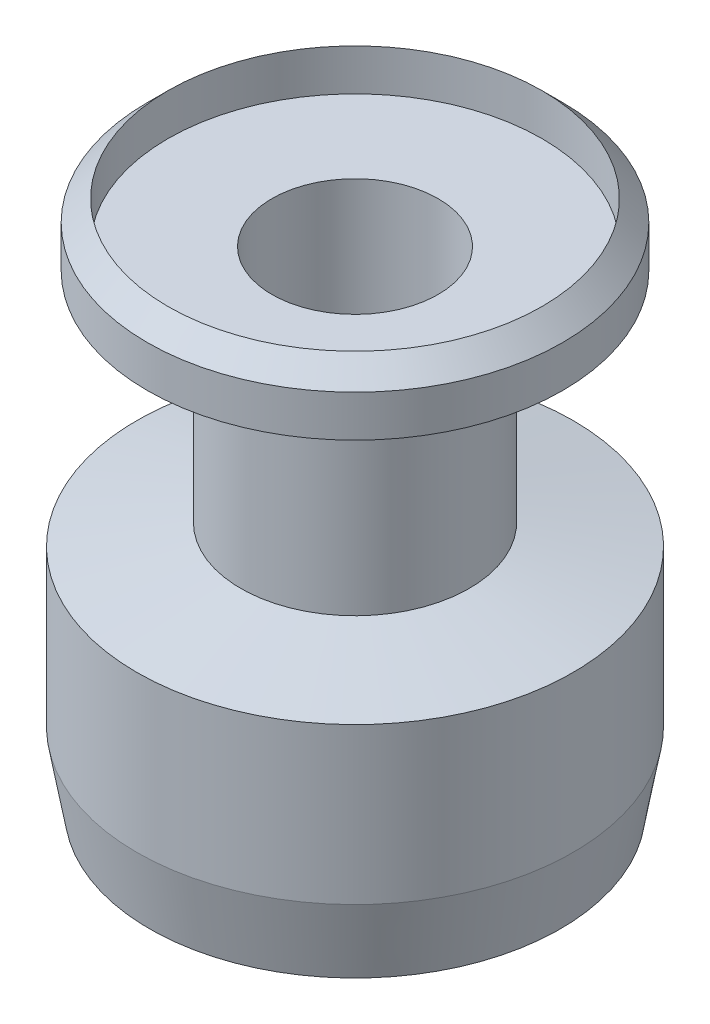
ISO-10303-21;
HEADER;
FILE_DESCRIPTION(('STEP AP214'),'2;1');
FILE_NAME('part.step','',(''),(''),'','','');
FILE_SCHEMA(('AUTOMOTIVE_DESIGN { 1 0 10303 214 1 1 1 1 }'));
ENDSEC;
DATA;
#1=APPLICATION_CONTEXT('core data for automotive mechanical design processes');
#2=APPLICATION_PROTOCOL_DEFINITION('international standard','automotive_design',2000,#1);
#3=PRODUCT_CONTEXT('',#1,'mechanical');
#4=PRODUCT('Part','Part','',(#3));
#5=PRODUCT_RELATED_PRODUCT_CATEGORY('part','',(#4));
#6=PRODUCT_DEFINITION_FORMATION('','',#4);
#7=PRODUCT_DEFINITION_CONTEXT('part definition',#1,'design');
#8=PRODUCT_DEFINITION('design','',#6,#7);
#9=PRODUCT_DEFINITION_SHAPE('','',#8);
#10=(LENGTH_UNIT() NAMED_UNIT(*) SI_UNIT(.MILLI.,.METRE.));
#11=(NAMED_UNIT(*) PLANE_ANGLE_UNIT() SI_UNIT($,.RADIAN.));
#12=(NAMED_UNIT(*) SI_UNIT($,.STERADIAN.) SOLID_ANGLE_UNIT());
#13=UNCERTAINTY_MEASURE_WITH_UNIT(LENGTH_MEASURE(1.E-05),#10,'distance_accuracy_value','');
#14=(GEOMETRIC_REPRESENTATION_CONTEXT(3) GLOBAL_UNCERTAINTY_ASSIGNED_CONTEXT((#13)) GLOBAL_UNIT_ASSIGNED_CONTEXT((#10,
#11,#12)) REPRESENTATION_CONTEXT('',''));
#15=CARTESIAN_POINT('',(0.,0.,0.));
#16=DIRECTION('',(0.,0.,1.));
#17=DIRECTION('',(1.,0.,0.));
#18=AXIS2_PLACEMENT_3D('',#15,#16,#17);
#19=CARTESIAN_POINT('',(0.,0.,0.));
#20=DIRECTION('',(0.,-1.,0.));
#21=DIRECTION('',(0.,0.,-1.));
#22=AXIS2_PLACEMENT_3D('',#19,#20,#21);
#23=CYLINDRICAL_SURFACE('',#22,8.);
#24=CARTESIAN_POINT('',(0.,31.,0.));
#25=DIRECTION('',(0.,-1.,0.));
#26=DIRECTION('',(0.,0.,-1.));
#27=AXIS2_PLACEMENT_3D('',#24,#25,#26);
#28=CIRCLE('',#27,8.);
#29=CARTESIAN_POINT('',(0.,31.,-8.));
#30=VERTEX_POINT('',#29);
#31=EDGE_CURVE('E119',#30,#30,#28,.T.);
#32=ORIENTED_EDGE('',*,*,#31,.F.);
#33=EDGE_LOOP('',(#32));
#34=FACE_BOUND('',#33,.T.);
#35=CARTESIAN_POINT('',(0.,20.,0.));
#36=DIRECTION('',(0.,-1.,0.));
#37=DIRECTION('',(0.,0.,-1.));
#38=AXIS2_PLACEMENT_3D('',#35,#36,#37);
#39=CIRCLE('',#38,8.);
#40=CARTESIAN_POINT('',(0.,20.,-8.));
#41=VERTEX_POINT('',#40);
#42=EDGE_CURVE('E10',#41,#41,#39,.T.);
#43=ORIENTED_EDGE('',*,*,#42,.T.);
#44=EDGE_LOOP('',(#43));
#45=FACE_BOUND('',#44,.T.);
#46=ADVANCED_FACE('F39',(#34,#45),#23,.F.);
#47=CARTESIAN_POINT('',(0.,20.,0.));
#48=DIRECTION('',(0.,1.,0.));
#49=DIRECTION('',(0.,0.,1.));
#50=AXIS2_PLACEMENT_3D('',#47,#48,#49);
#51=PLANE('',#50);
#52=ORIENTED_EDGE('',*,*,#42,.F.);
#53=EDGE_LOOP('',(#52));
#54=FACE_BOUND('',#53,.T.);
#55=CARTESIAN_POINT('',(0.,20.,0.));
#56=DIRECTION('',(0.,-1.,0.));
#57=DIRECTION('',(0.,0.,-1.));
#58=AXIS2_PLACEMENT_3D('',#55,#56,#57);
#59=CIRCLE('',#58,19.);
#60=CARTESIAN_POINT('',(0.,20.,-19.));
#61=VERTEX_POINT('',#60);
#62=EDGE_CURVE('E47',#61,#61,#59,.T.);
#63=ORIENTED_EDGE('',*,*,#62,.T.);
#64=EDGE_LOOP('',(#63));
#65=FACE_BOUND('',#64,.T.);
#66=ADVANCED_FACE('F41',(#54,#65),#51,.F.);
#67=CARTESIAN_POINT('',(0.,0.,0.));
#68=DIRECTION('',(0.,-1.,0.));
#69=DIRECTION('',(0.,0.,-1.));
#70=AXIS2_PLACEMENT_3D('',#67,#68,#69);
#71=CYLINDRICAL_SURFACE('',#70,19.);
#72=ORIENTED_EDGE('',*,*,#62,.F.);
#73=EDGE_LOOP('',(#72));
#74=FACE_BOUND('',#73,.T.);
#75=CARTESIAN_POINT('',(0.,0.,0.));
#76=DIRECTION('',(0.,-1.,0.));
#77=DIRECTION('',(0.,0.,-1.));
#78=AXIS2_PLACEMENT_3D('',#75,#76,#77);
#79=CIRCLE('',#78,19.);
#80=CARTESIAN_POINT('',(0.,0.,-19.));
#81=VERTEX_POINT('',#80);
#82=EDGE_CURVE('E52',#81,#81,#79,.T.);
#83=ORIENTED_EDGE('',*,*,#82,.T.);
#84=EDGE_LOOP('',(#83));
#85=FACE_BOUND('',#84,.T.);
#86=ADVANCED_FACE('F133',(#74,#85),#71,.F.);
#87=CARTESIAN_POINT('',(0.,0.,0.));
#88=DIRECTION('',(0.,-1.,0.));
#89=DIRECTION('',(0.,0.,-1.));
#90=AXIS2_PLACEMENT_3D('',#87,#88,#89);
#91=PLANE('',#90);
#92=CARTESIAN_POINT('',(0.,0.,0.));
#93=DIRECTION('',(0.,-1.,0.));
#94=DIRECTION('',(0.,0.,-1.));
#95=AXIS2_PLACEMENT_3D('',#92,#93,#94);
#96=CIRCLE('',#95,19.7657111350407);
#97=CARTESIAN_POINT('',(0.,0.,-19.7657111350407));
#98=VERTEX_POINT('',#97);
#99=EDGE_CURVE('E57',#98,#98,#96,.T.);
#100=ORIENTED_EDGE('',*,*,#99,.T.);
#101=EDGE_LOOP('',(#100));
#102=FACE_BOUND('',#101,.T.);
#103=ORIENTED_EDGE('',*,*,#82,.F.);
#104=EDGE_LOOP('',(#103));
#105=FACE_BOUND('',#104,.T.);
#106=ADVANCED_FACE('F192',(#102,#105),#91,.T.);
#107=CARTESIAN_POINT('',(0.,7.,0.));
#108=DIRECTION('',(0.,1.,0.));
#109=DIRECTION('',(0.,0.,1.));
#110=AXIS2_PLACEMENT_3D('',#107,#108,#109);
#111=CONICAL_SURFACE('',#110,21.,0.174532925199437);
#112=ORIENTED_EDGE('',*,*,#99,.F.);
#113=EDGE_LOOP('',(#112));
#114=FACE_BOUND('',#113,.T.);
#115=CARTESIAN_POINT('',(0.,7.,0.));
#116=DIRECTION('',(0.,-1.,0.));
#117=DIRECTION('',(0.,0.,-1.));
#118=AXIS2_PLACEMENT_3D('',#115,#116,#117);
#119=CIRCLE('',#118,21.);
#120=CARTESIAN_POINT('',(0.,7.,-21.));
#121=VERTEX_POINT('',#120);
#122=EDGE_CURVE('E63',#121,#121,#119,.T.);
#123=ORIENTED_EDGE('',*,*,#122,.T.);
#124=EDGE_LOOP('',(#123));
#125=FACE_BOUND('',#124,.T.);
#126=ADVANCED_FACE('F188',(#114,#125),#111,.T.);
#127=CARTESIAN_POINT('',(0.,0.,0.));
#128=DIRECTION('',(0.,-1.,0.));
#129=DIRECTION('',(0.,0.,-1.));
#130=AXIS2_PLACEMENT_3D('',#127,#128,#129);
#131=CYLINDRICAL_SURFACE('',#130,21.);
#132=CARTESIAN_POINT('',(0.,22.,0.));
#133=DIRECTION('',(0.,-1.,0.));
#134=DIRECTION('',(0.,0.,-1.));
#135=AXIS2_PLACEMENT_3D('',#132,#133,#134);
#136=CIRCLE('',#135,21.);
#137=CARTESIAN_POINT('',(0.,22.,-21.));
#138=VERTEX_POINT('',#137);
#139=EDGE_CURVE('E67',#138,#138,#136,.T.);
#140=ORIENTED_EDGE('',*,*,#139,.T.);
#141=EDGE_LOOP('',(#140));
#142=FACE_BOUND('',#141,.T.);
#143=ORIENTED_EDGE('',*,*,#122,.F.);
#144=EDGE_LOOP('',(#143));
#145=FACE_BOUND('',#144,.T.);
#146=ADVANCED_FACE('F184',(#142,#145),#131,.T.);
#147=CARTESIAN_POINT('',(0.,24.,0.));
#148=DIRECTION('',(0.,-1.,0.));
#149=DIRECTION('',(0.,0.,-1.));
#150=AXIS2_PLACEMENT_3D('',#147,#148,#149);
#151=CONICAL_SURFACE('',#150,11.,1.37340076694502);
#152=ORIENTED_EDGE('',*,*,#139,.F.);
#153=EDGE_LOOP('',(#152));
#154=FACE_BOUND('',#153,.T.);
#155=CARTESIAN_POINT('',(0.,24.,0.));
#156=DIRECTION('',(0.,-1.,0.));
#157=DIRECTION('',(0.,0.,-1.));
#158=AXIS2_PLACEMENT_3D('',#155,#156,#157);
#159=CIRCLE('',#158,11.);
#160=CARTESIAN_POINT('',(0.,24.,-11.));
#161=VERTEX_POINT('',#160);
#162=EDGE_CURVE('E71',#161,#161,#159,.T.);
#163=ORIENTED_EDGE('',*,*,#162,.T.);
#164=EDGE_LOOP('',(#163));
#165=FACE_BOUND('',#164,.T.);
#166=ADVANCED_FACE('F180',(#154,#165),#151,.T.);
#167=CARTESIAN_POINT('',(0.,0.,0.));
#168=DIRECTION('',(0.,-1.,0.));
#169=DIRECTION('',(0.,0.,-1.));
#170=AXIS2_PLACEMENT_3D('',#167,#168,#169);
#171=CYLINDRICAL_SURFACE('',#170,11.);
#172=ORIENTED_EDGE('',*,*,#162,.F.);
#173=EDGE_LOOP('',(#172));
#174=FACE_BOUND('',#173,.T.);
#175=CARTESIAN_POINT('',(0.,43.,0.));
#176=DIRECTION('',(0.,-1.,0.));
#177=DIRECTION('',(0.,0.,-1.));
#178=AXIS2_PLACEMENT_3D('',#175,#176,#177);
#179=CIRCLE('',#178,11.);
#180=CARTESIAN_POINT('',(0.,43.,-11.));
#181=VERTEX_POINT('',#180);
#182=EDGE_CURVE('E75',#181,#181,#179,.T.);
#183=ORIENTED_EDGE('',*,*,#182,.T.);
#184=EDGE_LOOP('',(#183));
#185=FACE_BOUND('',#184,.T.);
#186=ADVANCED_FACE('F176',(#174,#185),#171,.T.);
#187=CARTESIAN_POINT('',(0.,43.,0.));
#188=DIRECTION('',(0.,1.,0.));
#189=DIRECTION('',(0.,0.,1.));
#190=AXIS2_PLACEMENT_3D('',#187,#188,#189);
#191=CONICAL_SURFACE('',#190,11.,1.35212738092095);
#192=CARTESIAN_POINT('',(0.,45.,0.));
#193=DIRECTION('',(0.,-1.,0.));
#194=DIRECTION('',(0.,0.,-1.));
#195=AXIS2_PLACEMENT_3D('',#192,#193,#194);
#196=CIRCLE('',#195,20.);
#197=CARTESIAN_POINT('',(0.,45.,-20.));
#198=VERTEX_POINT('',#197);
#199=EDGE_CURVE('E79',#198,#198,#196,.T.);
#200=ORIENTED_EDGE('',*,*,#199,.T.);
#201=EDGE_LOOP('',(#200));
#202=FACE_BOUND('',#201,.T.);
#203=ORIENTED_EDGE('',*,*,#182,.F.);
#204=EDGE_LOOP('',(#203));
#205=FACE_BOUND('',#204,.T.);
#206=ADVANCED_FACE('F169',(#202,#205),#191,.T.);
#207=CARTESIAN_POINT('',(0.,0.,0.));
#208=DIRECTION('',(0.,-1.,0.));
#209=DIRECTION('',(0.,0.,-1.));
#210=AXIS2_PLACEMENT_3D('',#207,#208,#209);
#211=CYLINDRICAL_SURFACE('',#210,20.);
#212=ORIENTED_EDGE('',*,*,#199,.F.);
#213=EDGE_LOOP('',(#212));
#214=FACE_BOUND('',#213,.T.);
#215=CARTESIAN_POINT('',(0.,49.,0.));
#216=DIRECTION('',(0.,-1.,0.));
#217=DIRECTION('',(0.,0.,-1.));
#218=AXIS2_PLACEMENT_3D('',#215,#216,#217);
#219=CIRCLE('',#218,20.);
#220=CARTESIAN_POINT('',(0.,49.,-20.));
#221=VERTEX_POINT('',#220);
#222=EDGE_CURVE('E83',#221,#221,#219,.T.);
#223=ORIENTED_EDGE('',*,*,#222,.T.);
#224=EDGE_LOOP('',(#223));
#225=FACE_BOUND('',#224,.T.);
#226=ADVANCED_FACE('F163',(#214,#225),#211,.T.);
#227=CARTESIAN_POINT('',(0.,51.,0.));
#228=DIRECTION('',(0.,-1.,0.));
#229=DIRECTION('',(0.,0.,-1.));
#230=AXIS2_PLACEMENT_3D('',#227,#228,#229);
#231=CONICAL_SURFACE('',#230,18.,0.785398163397447);
#232=ORIENTED_EDGE('',*,*,#222,.F.);
#233=EDGE_LOOP('',(#232));
#234=FACE_BOUND('',#233,.T.);
#235=CARTESIAN_POINT('',(0.,51.,0.));
#236=DIRECTION('',(0.,-1.,0.));
#237=DIRECTION('',(0.,0.,-1.));
#238=AXIS2_PLACEMENT_3D('',#235,#236,#237);
#239=CIRCLE('',#238,18.);
#240=CARTESIAN_POINT('',(0.,51.,-18.));
#241=VERTEX_POINT('',#240);
#242=EDGE_CURVE('E87',#241,#241,#239,.T.);
#243=ORIENTED_EDGE('',*,*,#242,.T.);
#244=EDGE_LOOP('',(#243));
#245=FACE_BOUND('',#244,.T.);
#246=ADVANCED_FACE('F158',(#234,#245),#231,.T.);
#247=CARTESIAN_POINT('',(0.,0.,0.));
#248=DIRECTION('',(0.,-1.,0.));
#249=DIRECTION('',(0.,0.,-1.));
#250=AXIS2_PLACEMENT_3D('',#247,#248,#249);
#251=CYLINDRICAL_SURFACE('',#250,18.);
#252=CARTESIAN_POINT('',(0.,47.,0.));
#253=DIRECTION('',(0.,-1.,0.));
#254=DIRECTION('',(0.,0.,-1.));
#255=AXIS2_PLACEMENT_3D('',#252,#253,#254);
#256=CIRCLE('',#255,18.);
#257=CARTESIAN_POINT('',(0.,47.,-18.));
#258=VERTEX_POINT('',#257);
#259=EDGE_CURVE('E91',#258,#258,#256,.T.);
#260=ORIENTED_EDGE('',*,*,#259,.T.);
#261=EDGE_LOOP('',(#260));
#262=FACE_BOUND('',#261,.T.);
#263=ORIENTED_EDGE('',*,*,#242,.F.);
#264=EDGE_LOOP('',(#263));
#265=FACE_BOUND('',#264,.T.);
#266=ADVANCED_FACE('F147',(#262,#265),#251,.F.);
#267=CARTESIAN_POINT('',(0.,47.,0.));
#268=DIRECTION('',(0.,1.,0.));
#269=DIRECTION('',(0.,0.,1.));
#270=AXIS2_PLACEMENT_3D('',#267,#268,#269);
#271=PLANE('',#270);
#272=CARTESIAN_POINT('',(0.,47.,0.));
#273=DIRECTION('',(0.,-1.,0.));
#274=DIRECTION('',(0.,0.,-1.));
#275=AXIS2_PLACEMENT_3D('',#272,#273,#274);
#276=CIRCLE('',#275,8.);
#277=CARTESIAN_POINT('',(0.,47.,-8.));
#278=VERTEX_POINT('',#277);
#279=EDGE_CURVE('E95',#278,#278,#276,.T.);
#280=ORIENTED_EDGE('',*,*,#279,.T.);
#281=EDGE_LOOP('',(#280));
#282=FACE_BOUND('',#281,.T.);
#283=ORIENTED_EDGE('',*,*,#259,.F.);
#284=EDGE_LOOP('',(#283));
#285=FACE_BOUND('',#284,.T.);
#286=ADVANCED_FACE('F139',(#282,#285),#271,.T.);
#287=ORIENTED_EDGE('',*,*,#279,.F.);
#288=EDGE_LOOP('',(#287));
#289=FACE_BOUND('',#288,.T.);
#290=CARTESIAN_POINT('',(0.,35.5,0.));
#291=DIRECTION('',(0.,-1.,0.));
#292=DIRECTION('',(0.,0.,-1.));
#293=AXIS2_PLACEMENT_3D('',#290,#291,#292);
#294=CIRCLE('',#293,8.);
#295=CARTESIAN_POINT('',(0.,35.5,-8.));
#296=VERTEX_POINT('',#295);
#297=EDGE_CURVE('E99',#296,#296,#294,.T.);
#298=ORIENTED_EDGE('',*,*,#297,.T.);
#299=EDGE_LOOP('',(#298));
#300=FACE_BOUND('',#299,.T.);
#301=ADVANCED_FACE('F129',(#289,#300),#23,.F.);
#302=CARTESIAN_POINT('',(0.,35.5,0.));
#303=DIRECTION('',(0.,1.,0.));
#304=DIRECTION('',(0.,0.,1.));
#305=AXIS2_PLACEMENT_3D('',#302,#303,#304);
#306=PLANE('',#305);
#307=CARTESIAN_POINT('',(0.,35.5,0.));
#308=DIRECTION('',(0.,-1.,0.));
#309=DIRECTION('',(0.,0.,-1.));
#310=AXIS2_PLACEMENT_3D('',#307,#308,#309);
#311=CIRCLE('',#310,4.);
#312=CARTESIAN_POINT('',(0.,35.5,-4.));
#313=VERTEX_POINT('',#312);
#314=EDGE_CURVE('E103',#313,#313,#311,.T.);
#315=ORIENTED_EDGE('',*,*,#314,.T.);
#316=EDGE_LOOP('',(#315));
#317=FACE_BOUND('',#316,.T.);
#318=ORIENTED_EDGE('',*,*,#297,.F.);
#319=EDGE_LOOP('',(#318));
#320=FACE_BOUND('',#319,.T.);
#321=ADVANCED_FACE('F138',(#317,#320),#306,.T.);
#322=CARTESIAN_POINT('',(0.,0.,0.));
#323=DIRECTION('',(0.,-1.,0.));
#324=DIRECTION('',(0.,0.,-1.));
#325=AXIS2_PLACEMENT_3D('',#322,#323,#324);
#326=CYLINDRICAL_SURFACE('',#325,4.);
#327=CARTESIAN_POINT('',(0.,33.,0.));
#328=DIRECTION('',(0.,-1.,0.));
#329=DIRECTION('',(0.,0.,-1.));
#330=AXIS2_PLACEMENT_3D('',#327,#328,#329);
#331=CIRCLE('',#330,4.);
#332=CARTESIAN_POINT('',(0.,33.,-4.));
#333=VERTEX_POINT('',#332);
#334=EDGE_CURVE('E107',#333,#333,#331,.T.);
#335=ORIENTED_EDGE('',*,*,#334,.T.);
#336=EDGE_LOOP('',(#335));
#337=FACE_BOUND('',#336,.T.);
#338=ORIENTED_EDGE('',*,*,#314,.F.);
#339=EDGE_LOOP('',(#338));
#340=FACE_BOUND('',#339,.T.);
#341=ADVANCED_FACE('F145',(#337,#340),#326,.F.);
#342=CARTESIAN_POINT('',(0.,33.,0.));
#343=DIRECTION('',(0.,1.,0.));
#344=DIRECTION('',(0.,0.,1.));
#345=AXIS2_PLACEMENT_3D('',#342,#343,#344);
#346=PLANE('',#345);
#347=CARTESIAN_POINT('',(0.,33.,0.));
#348=DIRECTION('',(0.,-1.,0.));
#349=DIRECTION('',(0.,0.,-1.));
#350=AXIS2_PLACEMENT_3D('',#347,#348,#349);
#351=CIRCLE('',#350,2.);
#352=CARTESIAN_POINT('',(0.,33.,-2.));
#353=VERTEX_POINT('',#352);
#354=EDGE_CURVE('E111',#353,#353,#351,.T.);
#355=ORIENTED_EDGE('',*,*,#354,.T.);
#356=EDGE_LOOP('',(#355));
#357=FACE_BOUND('',#356,.T.);
#358=ORIENTED_EDGE('',*,*,#334,.F.);
#359=EDGE_LOOP('',(#358));
#360=FACE_BOUND('',#359,.T.);
#361=ADVANCED_FACE('F270',(#357,#360),#346,.T.);
#362=CARTESIAN_POINT('',(0.,0.,0.));
#363=DIRECTION('',(0.,-1.,0.));
#364=DIRECTION('',(0.,0.,-1.));
#365=AXIS2_PLACEMENT_3D('',#362,#363,#364);
#366=CYLINDRICAL_SURFACE('',#365,2.);
#367=CARTESIAN_POINT('',(0.,31.,0.));
#368=DIRECTION('',(0.,-1.,0.));
#369=DIRECTION('',(0.,0.,-1.));
#370=AXIS2_PLACEMENT_3D('',#367,#368,#369);
#371=CIRCLE('',#370,2.);
#372=CARTESIAN_POINT('',(0.,31.,-2.));
#373=VERTEX_POINT('',#372);
#374=EDGE_CURVE('E115',#373,#373,#371,.T.);
#375=ORIENTED_EDGE('',*,*,#374,.T.);
#376=EDGE_LOOP('',(#375));
#377=FACE_BOUND('',#376,.T.);
#378=ORIENTED_EDGE('',*,*,#354,.F.);
#379=EDGE_LOOP('',(#378));
#380=FACE_BOUND('',#379,.T.);
#381=ADVANCED_FACE('F280',(#377,#380),#366,.F.);
#382=CARTESIAN_POINT('',(0.,31.,0.));
#383=DIRECTION('',(0.,-1.,0.));
#384=DIRECTION('',(0.,0.,-1.));
#385=AXIS2_PLACEMENT_3D('',#382,#383,#384);
#386=PLANE('',#385);
#387=ORIENTED_EDGE('',*,*,#31,.T.);
#388=EDGE_LOOP('',(#387));
#389=FACE_BOUND('',#388,.T.);
#390=ORIENTED_EDGE('',*,*,#374,.F.);
#391=EDGE_LOOP('',(#390));
#392=FACE_BOUND('',#391,.T.);
#393=ADVANCED_FACE('F124',(#389,#392),#386,.T.);
#394=CLOSED_SHELL('',(#46,#66,#86,#106,#126,#146,#166,#186,#206,#226,#246,#266,#286,#301,#321,
#341,#361,#381,#393));
#395=MANIFOLD_SOLID_BREP('B2',#394);
#396=ADVANCED_BREP_SHAPE_REPRESENTATION('',(#18,#395),#14);
#397=SHAPE_DEFINITION_REPRESENTATION(#9,#396);
ENDSEC;
END-ISO-10303-21;
